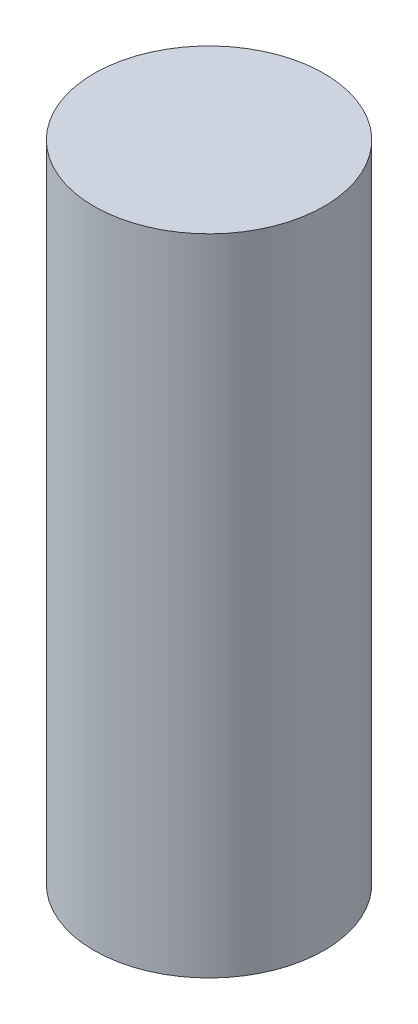
ISO-10303-21;
HEADER;
FILE_DESCRIPTION(('STEP AP214'),'2;1');
FILE_NAME('part.step','',(''),(''),'','','');
FILE_SCHEMA(('AUTOMOTIVE_DESIGN { 1 0 10303 214 1 1 1 1 }'));
ENDSEC;
DATA;
#1=APPLICATION_CONTEXT('core data for automotive mechanical design processes');
#2=APPLICATION_PROTOCOL_DEFINITION('international standard','automotive_design',2000,#1);
#3=PRODUCT_CONTEXT('',#1,'mechanical');
#4=PRODUCT('Part','Part','',(#3));
#5=PRODUCT_RELATED_PRODUCT_CATEGORY('part','',(#4));
#6=PRODUCT_DEFINITION_FORMATION('','',#4);
#7=PRODUCT_DEFINITION_CONTEXT('part definition',#1,'design');
#8=PRODUCT_DEFINITION('design','',#6,#7);
#9=PRODUCT_DEFINITION_SHAPE('','',#8);
#10=(LENGTH_UNIT() NAMED_UNIT(*) SI_UNIT(.MILLI.,.METRE.));
#11=(NAMED_UNIT(*) PLANE_ANGLE_UNIT() SI_UNIT($,.RADIAN.));
#12=(NAMED_UNIT(*) SI_UNIT($,.STERADIAN.) SOLID_ANGLE_UNIT());
#13=UNCERTAINTY_MEASURE_WITH_UNIT(LENGTH_MEASURE(1.E-05),#10,'distance_accuracy_value','');
#14=(GEOMETRIC_REPRESENTATION_CONTEXT(3) GLOBAL_UNCERTAINTY_ASSIGNED_CONTEXT((#13)) GLOBAL_UNIT_ASSIGNED_CONTEXT((#10,
#11,#12)) REPRESENTATION_CONTEXT('',''));
#15=CARTESIAN_POINT('',(0.,0.,0.));
#16=DIRECTION('',(0.,0.,1.));
#17=DIRECTION('',(1.,0.,0.));
#18=AXIS2_PLACEMENT_3D('',#15,#16,#17);
#19=CARTESIAN_POINT('',(0.,-70.,0.));
#20=DIRECTION('',(0.,1.,0.));
#21=DIRECTION('',(0.,0.,1.));
#22=AXIS2_PLACEMENT_3D('',#19,#20,#21);
#23=CYLINDRICAL_SURFACE('',#22,12.5);
#24=CARTESIAN_POINT('',(0.,-70.,0.));
#25=DIRECTION('',(0.,1.,0.));
#26=DIRECTION('',(0.,0.,1.));
#27=AXIS2_PLACEMENT_3D('',#24,#25,#26);
#28=CIRCLE('',#27,12.5);
#29=CARTESIAN_POINT('',(0.,-70.,12.5));
#30=VERTEX_POINT('',#29);
#31=EDGE_CURVE('E10',#30,#30,#28,.T.);
#32=ORIENTED_EDGE('',*,*,#31,.T.);
#33=EDGE_LOOP('',(#32));
#34=FACE_BOUND('',#33,.T.);
#35=CARTESIAN_POINT('',(0.,0.,0.));
#36=DIRECTION('',(0.,1.,0.));
#37=DIRECTION('',(0.,0.,1.));
#38=AXIS2_PLACEMENT_3D('',#35,#36,#37);
#39=CIRCLE('',#38,12.5);
#40=CARTESIAN_POINT('',(0.,0.,12.5));
#41=VERTEX_POINT('',#40);
#42=EDGE_CURVE('E36',#41,#41,#39,.T.);
#43=ORIENTED_EDGE('',*,*,#42,.F.);
#44=EDGE_LOOP('',(#43));
#45=FACE_BOUND('',#44,.T.);
#46=ADVANCED_FACE('F33',(#34,#45),#23,.T.);
#47=CARTESIAN_POINT('',(0.,-70.,0.));
#48=DIRECTION('',(0.,1.,0.));
#49=DIRECTION('',(0.,0.,1.));
#50=AXIS2_PLACEMENT_3D('',#47,#48,#49);
#51=PLANE('',#50);
#52=ORIENTED_EDGE('',*,*,#31,.F.);
#53=EDGE_LOOP('',(#52));
#54=FACE_BOUND('',#53,.T.);
#55=ADVANCED_FACE('F48',(#54),#51,.F.);
#56=CARTESIAN_POINT('',(0.,0.,0.));
#57=DIRECTION('',(0.,1.,0.));
#58=DIRECTION('',(0.,0.,1.));
#59=AXIS2_PLACEMENT_3D('',#56,#57,#58);
#60=PLANE('',#59);
#61=ORIENTED_EDGE('',*,*,#42,.T.);
#62=EDGE_LOOP('',(#61));
#63=FACE_BOUND('',#62,.T.);
#64=ADVANCED_FACE('F45',(#63),#60,.T.);
#65=CLOSED_SHELL('',(#46,#55,#64));
#66=MANIFOLD_SOLID_BREP('B2',#65);
#67=ADVANCED_BREP_SHAPE_REPRESENTATION('',(#18,#66),#14);
#68=SHAPE_DEFINITION_REPRESENTATION(#9,#67);
ENDSEC;
END-ISO-10303-21;
